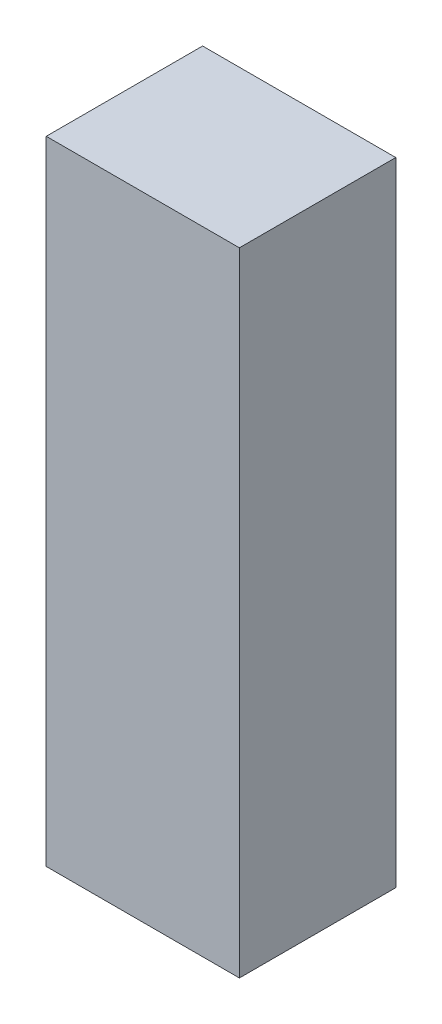
ISO-10303-21;
HEADER;
FILE_DESCRIPTION(('STEP AP214'),'2;1');
FILE_NAME('part.step','',(''),(''),'','','');
FILE_SCHEMA(('AUTOMOTIVE_DESIGN { 1 0 10303 214 1 1 1 1 }'));
ENDSEC;
DATA;
#1=APPLICATION_CONTEXT('core data for automotive mechanical design processes');
#2=APPLICATION_PROTOCOL_DEFINITION('international standard','automotive_design',2000,#1);
#3=PRODUCT_CONTEXT('',#1,'mechanical');
#4=PRODUCT('Part','Part','',(#3));
#5=PRODUCT_RELATED_PRODUCT_CATEGORY('part','',(#4));
#6=PRODUCT_DEFINITION_FORMATION('','',#4);
#7=PRODUCT_DEFINITION_CONTEXT('part definition',#1,'design');
#8=PRODUCT_DEFINITION('design','',#6,#7);
#9=PRODUCT_DEFINITION_SHAPE('','',#8);
#10=(LENGTH_UNIT() NAMED_UNIT(*) SI_UNIT(.MILLI.,.METRE.));
#11=(NAMED_UNIT(*) PLANE_ANGLE_UNIT() SI_UNIT($,.RADIAN.));
#12=(NAMED_UNIT(*) SI_UNIT($,.STERADIAN.) SOLID_ANGLE_UNIT());
#13=UNCERTAINTY_MEASURE_WITH_UNIT(LENGTH_MEASURE(1.E-05),#10,'distance_accuracy_value','');
#14=(GEOMETRIC_REPRESENTATION_CONTEXT(3) GLOBAL_UNCERTAINTY_ASSIGNED_CONTEXT((#13)) GLOBAL_UNIT_ASSIGNED_CONTEXT((#10,
#11,#12)) REPRESENTATION_CONTEXT('',''));
#15=CARTESIAN_POINT('',(0.,0.,0.));
#16=DIRECTION('',(0.,0.,1.));
#17=DIRECTION('',(1.,0.,0.));
#18=AXIS2_PLACEMENT_3D('',#15,#16,#17);
#19=CARTESIAN_POINT('',(-59.7466666666667,275.,-24.5933333333333));
#20=DIRECTION('',(1.,0.,0.));
#21=DIRECTION('',(0.,0.,-1.));
#22=AXIS2_PLACEMENT_3D('',#19,#20,#21);
#23=PLANE('',#22);
#24=DIRECTION('',(0.,0.,1.));
#25=VECTOR('',#24,1.);
#26=CARTESIAN_POINT('',(-59.7466666666667,0.,-24.5933333333333));
#27=LINE('',#26,#25);
#28=CARTESIAN_POINT('',(-59.7466666666667,0.,-24.5933333333333));
#29=VERTEX_POINT('',#28);
#30=CARTESIAN_POINT('',(-59.7466666666666,0.,43.4066666666667));
#31=VERTEX_POINT('',#30);
#32=EDGE_CURVE('E102',#29,#31,#27,.T.);
#33=ORIENTED_EDGE('',*,*,#32,.T.);
#34=DIRECTION('',(0.,-1.,0.));
#35=VECTOR('',#34,1.);
#36=CARTESIAN_POINT('',(-59.7466666666666,275.,43.4066666666667));
#37=LINE('',#36,#35);
#38=CARTESIAN_POINT('',(-59.7466666666666,275.,43.4066666666667));
#39=VERTEX_POINT('',#38);
#40=EDGE_CURVE('E11',#39,#31,#37,.T.);
#41=ORIENTED_EDGE('',*,*,#40,.F.);
#42=DIRECTION('',(0.,0.,1.));
#43=VECTOR('',#42,1.);
#44=CARTESIAN_POINT('',(-59.7466666666667,275.,-24.5933333333333));
#45=LINE('',#44,#43);
#46=CARTESIAN_POINT('',(-59.7466666666667,275.,-24.5933333333333));
#47=VERTEX_POINT('',#46);
#48=EDGE_CURVE('E90',#47,#39,#45,.T.);
#49=ORIENTED_EDGE('',*,*,#48,.F.);
#50=DIRECTION('',(0.,-1.,0.));
#51=VECTOR('',#50,1.);
#52=CARTESIAN_POINT('',(-59.7466666666667,275.,-24.5933333333333));
#53=LINE('',#52,#51);
#54=EDGE_CURVE('E98',#47,#29,#53,.T.);
#55=ORIENTED_EDGE('',*,*,#54,.T.);
#56=EDGE_LOOP('',(#33,#41,#49,#55));
#57=FACE_BOUND('',#56,.T.);
#58=ADVANCED_FACE('F39',(#57),#23,.F.);
#59=CARTESIAN_POINT('',(-59.7466666666666,275.,43.4066666666667));
#60=DIRECTION('',(0.,0.,-1.));
#61=DIRECTION('',(-1.,0.,0.));
#62=AXIS2_PLACEMENT_3D('',#59,#60,#61);
#63=PLANE('',#62);
#64=DIRECTION('',(1.,0.,0.));
#65=VECTOR('',#64,1.);
#66=CARTESIAN_POINT('',(-59.7466666666666,0.,43.4066666666667));
#67=LINE('',#66,#65);
#68=CARTESIAN_POINT('',(24.2533333333334,0.,43.4066666666667));
#69=VERTEX_POINT('',#68);
#70=EDGE_CURVE('E94',#31,#69,#67,.T.);
#71=ORIENTED_EDGE('',*,*,#70,.T.);
#72=DIRECTION('',(0.,-1.,0.));
#73=VECTOR('',#72,1.);
#74=CARTESIAN_POINT('',(24.2533333333334,275.,43.4066666666667));
#75=LINE('',#74,#73);
#76=CARTESIAN_POINT('',(24.2533333333334,275.,43.4066666666667));
#77=VERTEX_POINT('',#76);
#78=EDGE_CURVE('E47',#77,#69,#75,.T.);
#79=ORIENTED_EDGE('',*,*,#78,.F.);
#80=DIRECTION('',(1.,0.,0.));
#81=VECTOR('',#80,1.);
#82=CARTESIAN_POINT('',(-59.7466666666666,275.,43.4066666666667));
#83=LINE('',#82,#81);
#84=EDGE_CURVE('E85',#39,#77,#83,.T.);
#85=ORIENTED_EDGE('',*,*,#84,.F.);
#86=ORIENTED_EDGE('',*,*,#40,.T.);
#87=EDGE_LOOP('',(#71,#79,#85,#86));
#88=FACE_BOUND('',#87,.T.);
#89=ADVANCED_FACE('F93',(#88),#63,.F.);
#90=CARTESIAN_POINT('',(24.2533333333334,275.,-24.5933333333333));
#91=DIRECTION('',(-1.,0.,0.));
#92=DIRECTION('',(0.,0.,1.));
#93=AXIS2_PLACEMENT_3D('',#90,#91,#92);
#94=PLANE('',#93);
#95=DIRECTION('',(0.,0.,-1.));
#96=VECTOR('',#95,1.);
#97=CARTESIAN_POINT('',(24.2533333333334,0.,-24.5933333333333));
#98=LINE('',#97,#96);
#99=CARTESIAN_POINT('',(24.2533333333334,0.,-24.5933333333333));
#100=VERTEX_POINT('',#99);
#101=EDGE_CURVE('E72',#69,#100,#98,.T.);
#102=ORIENTED_EDGE('',*,*,#101,.T.);
#103=DIRECTION('',(0.,-1.,0.));
#104=VECTOR('',#103,1.);
#105=CARTESIAN_POINT('',(24.2533333333334,275.,-24.5933333333333));
#106=LINE('',#105,#104);
#107=CARTESIAN_POINT('',(24.2533333333334,275.,-24.5933333333333));
#108=VERTEX_POINT('',#107);
#109=EDGE_CURVE('E95',#108,#100,#106,.T.);
#110=ORIENTED_EDGE('',*,*,#109,.F.);
#111=DIRECTION('',(0.,0.,-1.));
#112=VECTOR('',#111,1.);
#113=CARTESIAN_POINT('',(24.2533333333334,275.,-24.5933333333333));
#114=LINE('',#113,#112);
#115=EDGE_CURVE('E88',#77,#108,#114,.T.);
#116=ORIENTED_EDGE('',*,*,#115,.F.);
#117=ORIENTED_EDGE('',*,*,#78,.T.);
#118=EDGE_LOOP('',(#102,#110,#116,#117));
#119=FACE_BOUND('',#118,.T.);
#120=ADVANCED_FACE('F96',(#119),#94,.F.);
#121=CARTESIAN_POINT('',(-59.7466666666667,275.,-24.5933333333333));
#122=DIRECTION('',(0.,0.,1.));
#123=DIRECTION('',(1.,0.,0.));
#124=AXIS2_PLACEMENT_3D('',#121,#122,#123);
#125=PLANE('',#124);
#126=DIRECTION('',(-1.,0.,0.));
#127=VECTOR('',#126,1.);
#128=CARTESIAN_POINT('',(-59.7466666666667,0.,-24.5933333333333));
#129=LINE('',#128,#127);
#130=EDGE_CURVE('E78',#100,#29,#129,.T.);
#131=ORIENTED_EDGE('',*,*,#130,.T.);
#132=ORIENTED_EDGE('',*,*,#54,.F.);
#133=DIRECTION('',(-1.,0.,0.));
#134=VECTOR('',#133,1.);
#135=CARTESIAN_POINT('',(-59.7466666666667,275.,-24.5933333333333));
#136=LINE('',#135,#134);
#137=EDGE_CURVE('E55',#108,#47,#136,.T.);
#138=ORIENTED_EDGE('',*,*,#137,.F.);
#139=ORIENTED_EDGE('',*,*,#109,.T.);
#140=EDGE_LOOP('',(#131,#132,#138,#139));
#141=FACE_BOUND('',#140,.T.);
#142=ADVANCED_FACE('F109',(#141),#125,.F.);
#143=CARTESIAN_POINT('',(0.,275.,0.));
#144=DIRECTION('',(0.,1.,0.));
#145=DIRECTION('',(0.,0.,1.));
#146=AXIS2_PLACEMENT_3D('',#143,#144,#145);
#147=PLANE('',#146);
#148=ORIENTED_EDGE('',*,*,#48,.T.);
#149=ORIENTED_EDGE('',*,*,#84,.T.);
#150=ORIENTED_EDGE('',*,*,#115,.T.);
#151=ORIENTED_EDGE('',*,*,#137,.T.);
#152=EDGE_LOOP('',(#148,#149,#150,#151));
#153=FACE_BOUND('',#152,.T.);
#154=ADVANCED_FACE('F86',(#153),#147,.T.);
#155=CARTESIAN_POINT('',(0.,0.,0.));
#156=DIRECTION('',(0.,1.,0.));
#157=DIRECTION('',(0.,0.,1.));
#158=AXIS2_PLACEMENT_3D('',#155,#156,#157);
#159=PLANE('',#158);
#160=ORIENTED_EDGE('',*,*,#32,.F.);
#161=ORIENTED_EDGE('',*,*,#130,.F.);
#162=ORIENTED_EDGE('',*,*,#101,.F.);
#163=ORIENTED_EDGE('',*,*,#70,.F.);
#164=EDGE_LOOP('',(#160,#161,#162,#163));
#165=FACE_BOUND('',#164,.T.);
#166=ADVANCED_FACE('F112',(#165),#159,.F.);
#167=CLOSED_SHELL('',(#58,#89,#120,#142,#154,#166));
#168=MANIFOLD_SOLID_BREP('B2',#167);
#169=ADVANCED_BREP_SHAPE_REPRESENTATION('',(#18,#168),#14);
#170=SHAPE_DEFINITION_REPRESENTATION(#9,#169);
ENDSEC;
END-ISO-10303-21;
